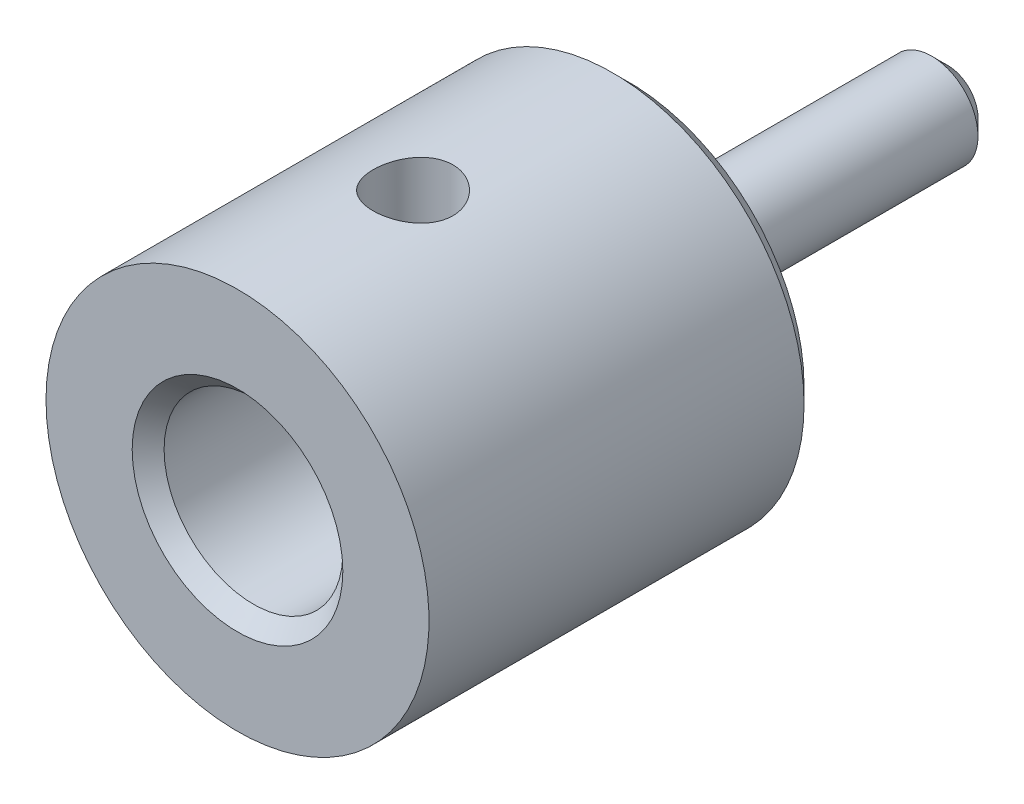
ISO-10303-21;
HEADER;
FILE_DESCRIPTION(('STEP AP214'),'2;1');
FILE_NAME('part.step','',(''),(''),'','','');
FILE_SCHEMA(('AUTOMOTIVE_DESIGN { 1 0 10303 214 1 1 1 1 }'));
ENDSEC;
DATA;
#1=APPLICATION_CONTEXT('core data for automotive mechanical design processes');
#2=APPLICATION_PROTOCOL_DEFINITION('international standard','automotive_design',2000,#1);
#3=PRODUCT_CONTEXT('',#1,'mechanical');
#4=PRODUCT('Part','Part','',(#3));
#5=PRODUCT_RELATED_PRODUCT_CATEGORY('part','',(#4));
#6=PRODUCT_DEFINITION_FORMATION('','',#4);
#7=PRODUCT_DEFINITION_CONTEXT('part definition',#1,'design');
#8=PRODUCT_DEFINITION('design','',#6,#7);
#9=PRODUCT_DEFINITION_SHAPE('','',#8);
#10=(LENGTH_UNIT() NAMED_UNIT(*) SI_UNIT(.MILLI.,.METRE.));
#11=(NAMED_UNIT(*) PLANE_ANGLE_UNIT() SI_UNIT($,.RADIAN.));
#12=(NAMED_UNIT(*) SI_UNIT($,.STERADIAN.) SOLID_ANGLE_UNIT());
#13=UNCERTAINTY_MEASURE_WITH_UNIT(LENGTH_MEASURE(1.E-05),#10,'distance_accuracy_value','');
#14=(GEOMETRIC_REPRESENTATION_CONTEXT(3) GLOBAL_UNCERTAINTY_ASSIGNED_CONTEXT((#13)) GLOBAL_UNIT_ASSIGNED_CONTEXT((#10,
#11,#12)) REPRESENTATION_CONTEXT('',''));
#15=CARTESIAN_POINT('',(0.,0.,0.));
#16=DIRECTION('',(0.,0.,1.));
#17=DIRECTION('',(1.,0.,0.));
#18=AXIS2_PLACEMENT_3D('',#15,#16,#17);
#19=CARTESIAN_POINT('',(0.,0.,0.));
#20=DIRECTION('',(0.,0.,-1.));
#21=DIRECTION('',(-1.,0.,0.));
#22=AXIS2_PLACEMENT_3D('',#19,#20,#21);
#23=PLANE('',#22);
#24=CARTESIAN_POINT('',(0.,0.,0.));
#25=DIRECTION('',(0.,0.,-1.));
#26=DIRECTION('',(-1.,0.,0.));
#27=AXIS2_PLACEMENT_3D('',#24,#25,#26);
#28=CIRCLE('',#27,3.3);
#29=CARTESIAN_POINT('',(-3.3,0.,0.));
#30=VERTEX_POINT('',#29);
#31=EDGE_CURVE('E11',#30,#30,#28,.T.);
#32=ORIENTED_EDGE('',*,*,#31,.T.);
#33=EDGE_LOOP('',(#32));
#34=FACE_BOUND('',#33,.T.);
#35=CARTESIAN_POINT('',(0.,0.,0.));
#36=DIRECTION('',(0.,0.,-1.));
#37=DIRECTION('',(-1.,0.,0.));
#38=AXIS2_PLACEMENT_3D('',#35,#36,#37);
#39=CIRCLE('',#38,6.);
#40=CARTESIAN_POINT('',(-6.,0.,0.));
#41=VERTEX_POINT('',#40);
#42=EDGE_CURVE('E76',#41,#41,#39,.T.);
#43=ORIENTED_EDGE('',*,*,#42,.F.);
#44=EDGE_LOOP('',(#43));
#45=FACE_BOUND('',#44,.T.);
#46=ADVANCED_FACE('F32',(#34,#45),#23,.F.);
#47=CARTESIAN_POINT('',(0.,0.,-22.25));
#48=DIRECTION('',(0.,0.,-1.));
#49=DIRECTION('',(-1.,0.,0.));
#50=AXIS2_PLACEMENT_3D('',#47,#48,#49);
#51=CYLINDRICAL_SURFACE('',#50,6.);
#52=CARTESIAN_POINT('',(0.,6.,-4.25000000000001));
#53=CARTESIAN_POINT('',(-0.0694090417016605,5.99999871526651,-4.25000247746923));
#54=CARTESIAN_POINT('',(-0.138848789520875,5.99878328775043,-4.25580066571875));
#55=CARTESIAN_POINT('',(-0.275761316266992,5.99405200990679,-4.27881934953286));
#56=CARTESIAN_POINT('',(-0.343232560128311,5.99053441189248,-4.29604852303694));
#57=CARTESIAN_POINT('',(-0.47420913229134,5.98159109196202,-4.34137045492183));
#58=CARTESIAN_POINT('',(-0.537718336709182,5.97616727052645,-4.36945239599889));
#59=CARTESIAN_POINT('',(-0.659120328605955,5.96399927809859,-4.43564960885619));
#60=CARTESIAN_POINT('',(-0.717013367534323,5.95725516625975,-4.47376443115584));
#61=CARTESIAN_POINT('',(-0.826390324308832,5.9430770002465,-4.55953634019065));
#62=CARTESIAN_POINT('',(-0.87778024416268,5.93563505848531,-4.60731200123508));
#63=CARTESIAN_POINT('',(-0.971877776769387,5.92095657692448,-4.71079465919511));
#64=CARTESIAN_POINT('',(-1.01458467096098,5.91372005416683,-4.76650231187227));
#65=CARTESIAN_POINT('',(-1.09051031677216,5.90019442595308,-4.88495196876616));
#66=CARTESIAN_POINT('',(-1.1236305468065,5.89391545174828,-4.94775838450274));
#67=CARTESIAN_POINT('',(-1.17881119348063,5.8831284065002,-5.07819745177276));
#68=CARTESIAN_POINT('',(-1.20087280167641,5.87862014467568,-5.14582958244254));
#69=CARTESIAN_POINT('',(-1.23300240133736,5.87196500986123,-5.28298523741564));
#70=CARTESIAN_POINT('',(-1.24323597696798,5.86978556855865,-5.35246835933477));
#71=CARTESIAN_POINT('',(-1.25193357655614,5.86793690716491,-5.49219684286263));
#72=CARTESIAN_POINT('',(-1.25039890894686,5.86826740800981,-5.5624421188653));
#73=CARTESIAN_POINT('',(-1.23573719037197,5.87137174319175,-5.70048102797517));
#74=CARTESIAN_POINT('',(-1.2228010523272,5.87410533679901,-5.76829597966121));
#75=CARTESIAN_POINT('',(-1.18600543529945,5.88164437615942,-5.90077150964492));
#76=CARTESIAN_POINT('',(-1.16214539481381,5.88644992841317,-5.96543192560633));
#77=CARTESIAN_POINT('',(-1.10400003213928,5.89763191464102,-6.09030722841598));
#78=CARTESIAN_POINT('',(-1.06964002534236,5.90401953785586,-6.15048629652707));
#79=CARTESIAN_POINT('',(-0.991522699274813,5.91763890010721,-6.26429574426816));
#80=CARTESIAN_POINT('',(-0.947764212262583,5.92487074398537,-6.31792530883597));
#81=CARTESIAN_POINT('',(-0.851074921546779,5.93953730929909,-6.41821396108037));
#82=CARTESIAN_POINT('',(-0.797981433412078,5.94697323199473,-6.46471616889701));
#83=CARTESIAN_POINT('',(-0.684667288611794,5.96108088143001,-6.54818044222897));
#84=CARTESIAN_POINT('',(-0.624446525025762,5.96775259670236,-6.58514236459839));
#85=CARTESIAN_POINT('',(-0.498405541235476,5.97959870942815,-6.64851008153595));
#86=CARTESIAN_POINT('',(-0.432575461926497,5.98477039710258,-6.67489680456711));
#87=CARTESIAN_POINT('',(-0.297284620972153,5.99301338211281,-6.71619170483549));
#88=CARTESIAN_POINT('',(-0.227824338595088,5.99608495596053,-6.73110139323139));
#89=CARTESIAN_POINT('',(-0.0885918657008345,5.99974275215455,-6.74879425206788));
#90=CARTESIAN_POINT('',(-0.0188480555261784,6.00037293537579,-6.75179194149424));
#91=CARTESIAN_POINT('',(0.120143798757714,5.99919952252774,-6.74615505003089));
#92=CARTESIAN_POINT('',(0.189391872962257,5.99739607548153,-6.7375211813984));
#93=CARTESIAN_POINT('',(0.324726367119812,5.99158564979184,-6.70904434653046));
#94=CARTESIAN_POINT('',(0.390837192894204,5.98760052868077,-6.68931251461653));
#95=CARTESIAN_POINT('',(0.518811446661329,5.97787227242395,-6.63932213957859));
#96=CARTESIAN_POINT('',(0.580674536336773,5.97212899744579,-6.60906275913401));
#97=CARTESIAN_POINT('',(0.699294306943491,5.95941241490714,-6.53841962176244));
#98=CARTESIAN_POINT('',(0.755973219469831,5.9524239381233,-6.49790807043093));
#99=CARTESIAN_POINT('',(0.861805445886517,5.93802568299709,-6.40808043692372));
#100=CARTESIAN_POINT('',(0.910957877913282,5.93061585542511,-6.35876332448105));
#101=CARTESIAN_POINT('',(1.0011786486518,5.91606024531377,-6.2517444230003));
#102=CARTESIAN_POINT('',(1.04209914600204,5.90892089307501,-6.19391696804472));
#103=CARTESIAN_POINT('',(1.11364719079243,5.89585601015806,-6.07208371578621));
#104=CARTESIAN_POINT('',(1.14427516677864,5.88993042894651,-6.00807817586089));
#105=CARTESIAN_POINT('',(1.19417246443922,5.88001700708041,-5.87603880370177));
#106=CARTESIAN_POINT('',(1.21350309828031,5.87601872784687,-5.80802896283416));
#107=CARTESIAN_POINT('',(1.24044038523407,5.87039184709697,-5.66963344950774));
#108=CARTESIAN_POINT('',(1.2480487154444,5.86876290660367,-5.59924811838056));
#109=CARTESIAN_POINT('',(1.25125926487611,5.86807907308506,-5.45958659900035));
#110=CARTESIAN_POINT('',(1.24709542622725,5.86897402321502,-5.39031592977794));
#111=CARTESIAN_POINT('',(1.22739905314031,5.87312447254928,-5.25348599107978));
#112=CARTESIAN_POINT('',(1.21186662782266,5.87637994909626,-5.18592670518389));
#113=CARTESIAN_POINT('',(1.16998217768584,5.88486132447716,-5.05460222810934));
#114=CARTESIAN_POINT('',(1.14366117568421,5.8900815700793,-4.99082675351308));
#115=CARTESIAN_POINT('',(1.08097457299757,5.90190705738738,-4.86856122397334));
#116=CARTESIAN_POINT('',(1.04460803983029,5.9085124276546,-4.81007166036688));
#117=CARTESIAN_POINT('',(0.962073695342406,5.92251579551146,-4.69887837292056));
#118=CARTESIAN_POINT('',(0.915737890418222,5.92992613868404,-4.64630087543502));
#119=CARTESIAN_POINT('',(0.814924438115331,5.94461839583213,-4.54959050677365));
#120=CARTESIAN_POINT('',(0.760444918832964,5.9519002798488,-4.50545958244852));
#121=CARTESIAN_POINT('',(0.6441344275077,5.96561444547637,-4.42641142681595));
#122=CARTESIAN_POINT('',(0.582225921521346,5.97203596073244,-4.39160632011372));
#123=CARTESIAN_POINT('',(0.453319843998452,5.98319908494092,-4.33294977156998));
#124=CARTESIAN_POINT('',(0.386326781907242,5.98794216182101,-4.30908875281813));
#125=CARTESIAN_POINT('',(0.266015292900104,5.99432499781443,-4.27745972171158));
#126=CARTESIAN_POINT('',(0.213367593727928,5.99644035661395,-4.26718123679115));
#127=CARTESIAN_POINT('',(0.107152674176536,5.99927832789758,-4.25345054572267));
#128=CARTESIAN_POINT('',(0.0535854878488715,6.00000099184586,-4.24999808733281));
#129=CARTESIAN_POINT('',(0.,6.,-4.25000000000001));
#130=B_SPLINE_CURVE_WITH_KNOTS('',3,(#52,#53,#54,#55,#56,#57,#58,#59,#60,#61,#62,#63,#64,#65,
#66,#67,#68,#69,#70,#71,#72,#73,#74,#75,#76,#77,#78,#79,#80,#81,#82,#83,#84,#85,#86,#87,#88,#89,
#90,#91,#92,#93,#94,#95,#96,#97,#98,#99,#100,#101,#102,#103,#104,#105,#106,#107,#108,#109,#110,
#111,#112,#113,#114,#115,#116,#117,#118,#119,#120,#121,#122,#123,#124,#125,#126,#127,#128,#129),
.UNSPECIFIED.,.T.,.F.,(4,2,2,2,2,2,2,2,2,2,2,2,2,2,2,2,2,2,2,2,2,2,2,2,2,2,2,2,2,2,2,2,2,2,2,2,
2,2,4),(0.,0.208031045103182,0.416220199906223,0.624202378825439,0.832175241572986,
1.04287526388122,1.25359271551785,1.46640449178548,1.67919333285489,1.88896575169853,
2.09871484767163,2.30501712129058,2.51133000030278,2.71914592416748,2.92698768368033,
3.13889526355464,3.35080602278216,3.56309724499661,3.7753605104577,3.98378339407674,
4.19219351552275,4.39855286632619,4.60492863390931,4.81401583995734,5.02312752564572,
5.23571263829334,5.44828889851306,5.65970050095022,5.87108185414182,6.07829223291036,
6.28550062281358,6.49211731393252,6.69875319081477,6.90919024830306,7.11967575117366,
7.33258864398253,7.5453148646497,7.70592588477276,7.86653096973387),.UNSPECIFIED.);
#131=CARTESIAN_POINT('',(0.,6.,-4.25000000000001));
#132=VERTEX_POINT('',#131);
#133=EDGE_CURVE('E70',#132,#132,#130,.T.);
#134=ORIENTED_EDGE('',*,*,#133,.T.);
#135=EDGE_LOOP('',(#134));
#136=FACE_BOUND('',#135,.T.);
#137=CARTESIAN_POINT('',(0.,0.,-11.75));
#138=DIRECTION('',(0.,0.,1.));
#139=DIRECTION('',(1.,0.,0.));
#140=AXIS2_PLACEMENT_3D('',#137,#138,#139);
#141=CIRCLE('',#140,6.);
#142=CARTESIAN_POINT('',(6.,0.,-11.75));
#143=VERTEX_POINT('',#142);
#144=EDGE_CURVE('E91',#143,#143,#141,.T.);
#145=ORIENTED_EDGE('',*,*,#144,.T.);
#146=EDGE_LOOP('',(#145));
#147=FACE_BOUND('',#146,.T.);
#148=ORIENTED_EDGE('',*,*,#42,.T.);
#149=EDGE_LOOP('',(#148));
#150=FACE_BOUND('',#149,.T.);
#151=ADVANCED_FACE('F112',(#136,#147,#150),#51,.T.);
#152=CARTESIAN_POINT('',(6.,0.,-12.25));
#153=DIRECTION('',(0.,0.,1.));
#154=DIRECTION('',(1.,0.,0.));
#155=AXIS2_PLACEMENT_3D('',#152,#153,#154);
#156=PLANE('',#155);
#157=CARTESIAN_POINT('',(0.,0.,-12.25));
#158=DIRECTION('',(0.,0.,1.));
#159=DIRECTION('',(1.,0.,0.));
#160=AXIS2_PLACEMENT_3D('',#157,#158,#159);
#161=CIRCLE('',#160,5.5);
#162=CARTESIAN_POINT('',(5.5,0.,-12.25));
#163=VERTEX_POINT('',#162);
#164=EDGE_CURVE('E88',#163,#163,#161,.F.);
#165=ORIENTED_EDGE('',*,*,#164,.T.);
#166=EDGE_LOOP('',(#165));
#167=FACE_BOUND('',#166,.T.);
#168=CARTESIAN_POINT('',(0.,0.,-12.25));
#169=DIRECTION('',(0.,0.,-1.));
#170=DIRECTION('',(-1.,0.,0.));
#171=AXIS2_PLACEMENT_3D('',#168,#169,#170);
#172=CIRCLE('',#171,1.45);
#173=CARTESIAN_POINT('',(-1.45,0.,-12.25));
#174=VERTEX_POINT('',#173);
#175=EDGE_CURVE('E73',#174,#174,#172,.T.);
#176=ORIENTED_EDGE('',*,*,#175,.F.);
#177=EDGE_LOOP('',(#176));
#178=FACE_BOUND('',#177,.T.);
#179=ADVANCED_FACE('F118',(#167,#178),#156,.F.);
#180=CARTESIAN_POINT('',(0.,0.,-22.25));
#181=DIRECTION('',(0.,0.,-1.));
#182=DIRECTION('',(-1.,0.,0.));
#183=AXIS2_PLACEMENT_3D('',#180,#181,#182);
#184=CYLINDRICAL_SURFACE('',#183,1.45);
#185=CARTESIAN_POINT('',(0.,0.,-21.75));
#186=DIRECTION('',(0.,0.,1.));
#187=DIRECTION('',(1.,0.,0.));
#188=AXIS2_PLACEMENT_3D('',#185,#186,#187);
#189=CIRCLE('',#188,1.45);
#190=CARTESIAN_POINT('',(1.45,0.,-21.75));
#191=VERTEX_POINT('',#190);
#192=EDGE_CURVE('E85',#191,#191,#189,.T.);
#193=ORIENTED_EDGE('',*,*,#192,.T.);
#194=EDGE_LOOP('',(#193));
#195=FACE_BOUND('',#194,.T.);
#196=ORIENTED_EDGE('',*,*,#175,.T.);
#197=EDGE_LOOP('',(#196));
#198=FACE_BOUND('',#197,.T.);
#199=ADVANCED_FACE('F139',(#195,#198),#184,.T.);
#200=CARTESIAN_POINT('',(1.45,0.,-22.25));
#201=DIRECTION('',(0.,0.,1.));
#202=DIRECTION('',(1.,0.,0.));
#203=AXIS2_PLACEMENT_3D('',#200,#201,#202);
#204=PLANE('',#203);
#205=CARTESIAN_POINT('',(0.,0.,-22.25));
#206=DIRECTION('',(0.,0.,1.));
#207=DIRECTION('',(1.,0.,0.));
#208=AXIS2_PLACEMENT_3D('',#205,#206,#207);
#209=CIRCLE('',#208,0.950000000000003);
#210=CARTESIAN_POINT('',(0.950000000000002,0.,-22.25));
#211=VERTEX_POINT('',#210);
#212=EDGE_CURVE('E82',#211,#211,#209,.F.);
#213=ORIENTED_EDGE('',*,*,#212,.T.);
#214=EDGE_LOOP('',(#213));
#215=FACE_BOUND('',#214,.T.);
#216=ADVANCED_FACE('F137',(#215),#204,.F.);
#217=CARTESIAN_POINT('',(0.,0.,-3.));
#218=DIRECTION('',(0.,0.,1.));
#219=DIRECTION('',(1.,0.,0.));
#220=AXIS2_PLACEMENT_3D('',#217,#218,#219);
#221=CYLINDRICAL_SURFACE('',#220,2.8);
#222=CARTESIAN_POINT('',(0.,0.,-0.499999999999997));
#223=DIRECTION('',(0.,0.,-1.));
#224=DIRECTION('',(-1.,0.,0.));
#225=AXIS2_PLACEMENT_3D('',#222,#223,#224);
#226=CIRCLE('',#225,2.8);
#227=CARTESIAN_POINT('',(-2.8,0.,-0.499999999999997));
#228=VERTEX_POINT('',#227);
#229=EDGE_CURVE('E41',#228,#228,#226,.F.);
#230=ORIENTED_EDGE('',*,*,#229,.T.);
#231=EDGE_LOOP('',(#230));
#232=FACE_BOUND('',#231,.T.);
#233=CARTESIAN_POINT('',(0.,0.,-3.));
#234=DIRECTION('',(0.,0.,1.));
#235=DIRECTION('',(1.,0.,0.));
#236=AXIS2_PLACEMENT_3D('',#233,#234,#235);
#237=CIRCLE('',#236,2.8);
#238=CARTESIAN_POINT('',(1.85202591774521,2.1,-3.));
#239=VERTEX_POINT('',#238);
#240=CARTESIAN_POINT('',(-1.85202591774521,2.1,-3.));
#241=VERTEX_POINT('',#240);
#242=EDGE_CURVE('E62',#239,#241,#237,.T.);
#243=ORIENTED_EDGE('',*,*,#242,.F.);
#244=DIRECTION('',(0.,0.,1.));
#245=VECTOR('',#244,1.);
#246=CARTESIAN_POINT('',(1.85202591774521,2.1,-8.5));
#247=LINE('',#246,#245);
#248=CARTESIAN_POINT('',(1.85202591774521,2.1,-8.5));
#249=VERTEX_POINT('',#248);
#250=EDGE_CURVE('E48',#249,#239,#247,.T.);
#251=ORIENTED_EDGE('',*,*,#250,.F.);
#252=CARTESIAN_POINT('',(0.,0.,-8.5));
#253=DIRECTION('',(0.,0.,1.));
#254=DIRECTION('',(1.,0.,0.));
#255=AXIS2_PLACEMENT_3D('',#252,#253,#254);
#256=CIRCLE('',#255,2.8);
#257=CARTESIAN_POINT('',(-1.85202591774521,2.1,-8.5));
#258=VERTEX_POINT('',#257);
#259=EDGE_CURVE('E64',#258,#249,#256,.T.);
#260=ORIENTED_EDGE('',*,*,#259,.F.);
#261=DIRECTION('',(0.,0.,1.));
#262=VECTOR('',#261,1.);
#263=CARTESIAN_POINT('',(-1.85202591774521,2.1,-8.5));
#264=LINE('',#263,#262);
#265=EDGE_CURVE('E54',#258,#241,#264,.T.);
#266=ORIENTED_EDGE('',*,*,#265,.T.);
#267=EDGE_LOOP('',(#243,#251,#260,#266));
#268=FACE_BOUND('',#267,.T.);
#269=ADVANCED_FACE('F60',(#232,#268),#221,.F.);
#270=CARTESIAN_POINT('',(0.,0.,-3.));
#271=DIRECTION('',(0.,0.,1.));
#272=DIRECTION('',(1.,0.,0.));
#273=AXIS2_PLACEMENT_3D('',#270,#271,#272);
#274=PLANE('',#273);
#275=DIRECTION('',(-1.,0.,0.));
#276=VECTOR('',#275,1.);
#277=CARTESIAN_POINT('',(-1.85202591774521,2.1,-3.));
#278=LINE('',#277,#276);
#279=EDGE_CURVE('E67',#239,#241,#278,.T.);
#280=ORIENTED_EDGE('',*,*,#279,.F.);
#281=ORIENTED_EDGE('',*,*,#242,.T.);
#282=EDGE_LOOP('',(#280,#281));
#283=FACE_BOUND('',#282,.T.);
#284=ADVANCED_FACE('F72',(#283),#274,.T.);
#285=CARTESIAN_POINT('',(-1.85202591774521,2.1,-8.5));
#286=DIRECTION('',(0.,1.,0.));
#287=DIRECTION('',(0.,0.,1.));
#288=AXIS2_PLACEMENT_3D('',#285,#286,#287);
#289=PLANE('',#288);
#290=CARTESIAN_POINT('',(0.,2.1,-5.5));
#291=DIRECTION('',(0.,1.,0.));
#292=DIRECTION('',(0.,0.,1.));
#293=AXIS2_PLACEMENT_3D('',#290,#291,#292);
#294=CIRCLE('',#293,1.24999999999999);
#295=CARTESIAN_POINT('',(0.,2.1,-4.25000000000001));
#296=VERTEX_POINT('',#295);
#297=EDGE_CURVE('E36',#296,#296,#294,.T.);
#298=ORIENTED_EDGE('',*,*,#297,.T.);
#299=EDGE_LOOP('',(#298));
#300=FACE_BOUND('',#299,.T.);
#301=ORIENTED_EDGE('',*,*,#279,.T.);
#302=ORIENTED_EDGE('',*,*,#265,.F.);
#303=DIRECTION('',(-1.,0.,0.));
#304=VECTOR('',#303,1.);
#305=CARTESIAN_POINT('',(-1.85202591774521,2.1,-8.5));
#306=LINE('',#305,#304);
#307=EDGE_CURVE('E238',#249,#258,#306,.T.);
#308=ORIENTED_EDGE('',*,*,#307,.F.);
#309=ORIENTED_EDGE('',*,*,#250,.T.);
#310=EDGE_LOOP('',(#301,#302,#308,#309));
#311=FACE_BOUND('',#310,.T.);
#312=ADVANCED_FACE('F68',(#300,#311),#289,.F.);
#313=CARTESIAN_POINT('',(0.,0.,-8.5));
#314=DIRECTION('',(0.,0.,1.));
#315=DIRECTION('',(1.,0.,0.));
#316=AXIS2_PLACEMENT_3D('',#313,#314,#315);
#317=PLANE('',#316);
#318=ORIENTED_EDGE('',*,*,#259,.T.);
#319=ORIENTED_EDGE('',*,*,#307,.T.);
#320=EDGE_LOOP('',(#318,#319));
#321=FACE_BOUND('',#320,.T.);
#322=ADVANCED_FACE('F126',(#321),#317,.T.);
#323=CARTESIAN_POINT('',(0.,0.,-22.25));
#324=DIRECTION('',(0.,0.,1.));
#325=DIRECTION('',(1.,0.,0.));
#326=AXIS2_PLACEMENT_3D('',#323,#324,#325);
#327=CONICAL_SURFACE('',#326,0.950000000000003,0.785398163397448);
#328=ORIENTED_EDGE('',*,*,#192,.F.);
#329=EDGE_LOOP('',(#328));
#330=FACE_BOUND('',#329,.T.);
#331=ORIENTED_EDGE('',*,*,#212,.F.);
#332=EDGE_LOOP('',(#331));
#333=FACE_BOUND('',#332,.T.);
#334=ADVANCED_FACE('F108',(#330,#333),#327,.T.);
#335=CARTESIAN_POINT('',(0.,0.,-12.25));
#336=DIRECTION('',(0.,0.,1.));
#337=DIRECTION('',(1.,0.,0.));
#338=AXIS2_PLACEMENT_3D('',#335,#336,#337);
#339=CONICAL_SURFACE('',#338,5.5,0.785398163397446);
#340=ORIENTED_EDGE('',*,*,#144,.F.);
#341=EDGE_LOOP('',(#340));
#342=FACE_BOUND('',#341,.T.);
#343=ORIENTED_EDGE('',*,*,#164,.F.);
#344=EDGE_LOOP('',(#343));
#345=FACE_BOUND('',#344,.T.);
#346=ADVANCED_FACE('F100',(#342,#345),#339,.T.);
#347=CARTESIAN_POINT('',(0.,0.,-0.499999999999997));
#348=DIRECTION('',(0.,0.,1.));
#349=DIRECTION('',(1.,0.,0.));
#350=AXIS2_PLACEMENT_3D('',#347,#348,#349);
#351=CONICAL_SURFACE('',#350,2.8,0.785398163397452);
#352=ORIENTED_EDGE('',*,*,#31,.F.);
#353=EDGE_LOOP('',(#352));
#354=FACE_BOUND('',#353,.T.);
#355=ORIENTED_EDGE('',*,*,#229,.F.);
#356=EDGE_LOOP('',(#355));
#357=FACE_BOUND('',#356,.T.);
#358=ADVANCED_FACE('F34',(#354,#357),#351,.F.);
#359=CARTESIAN_POINT('',(0.,6.,-5.5));
#360=DIRECTION('',(0.,1.,0.));
#361=DIRECTION('',(0.,0.,1.));
#362=AXIS2_PLACEMENT_3D('',#359,#360,#361);
#363=CYLINDRICAL_SURFACE('',#362,1.24999999999999);
#364=ORIENTED_EDGE('',*,*,#297,.F.);
#365=EDGE_LOOP('',(#364));
#366=FACE_BOUND('',#365,.T.);
#367=ORIENTED_EDGE('',*,*,#133,.F.);
#368=EDGE_LOOP('',(#367));
#369=FACE_BOUND('',#368,.T.);
#370=ADVANCED_FACE('F99',(#366,#369),#363,.F.);
#371=CLOSED_SHELL('',(#46,#151,#179,#199,#216,#269,#284,#312,#322,#334,#346,#358,#370));
#372=MANIFOLD_SOLID_BREP('B2',#371);
#373=ADVANCED_BREP_SHAPE_REPRESENTATION('',(#18,#372),#14);
#374=SHAPE_DEFINITION_REPRESENTATION(#9,#373);
ENDSEC;
END-ISO-10303-21;
